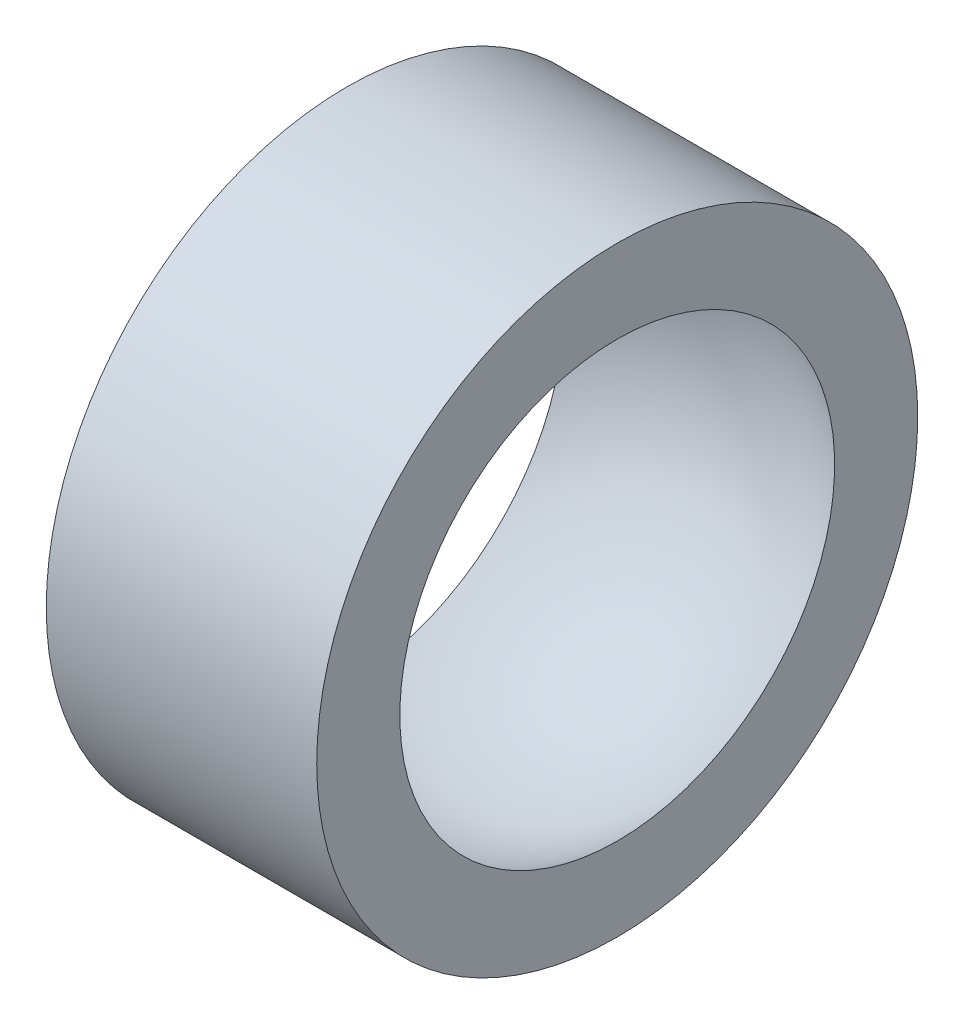
ISO-10303-21;
HEADER;
FILE_DESCRIPTION(('STEP AP214'),'2;1');
FILE_NAME('part.step','',(''),(''),'','','');
FILE_SCHEMA(('AUTOMOTIVE_DESIGN { 1 0 10303 214 1 1 1 1 }'));
ENDSEC;
DATA;
#1=APPLICATION_CONTEXT('core data for automotive mechanical design processes');
#2=APPLICATION_PROTOCOL_DEFINITION('international standard','automotive_design',2000,#1);
#3=PRODUCT_CONTEXT('',#1,'mechanical');
#4=PRODUCT('Part','Part','',(#3));
#5=PRODUCT_RELATED_PRODUCT_CATEGORY('part','',(#4));
#6=PRODUCT_DEFINITION_FORMATION('','',#4);
#7=PRODUCT_DEFINITION_CONTEXT('part definition',#1,'design');
#8=PRODUCT_DEFINITION('design','',#6,#7);
#9=PRODUCT_DEFINITION_SHAPE('','',#8);
#10=(LENGTH_UNIT() NAMED_UNIT(*) SI_UNIT(.MILLI.,.METRE.));
#11=(NAMED_UNIT(*) PLANE_ANGLE_UNIT() SI_UNIT($,.RADIAN.));
#12=(NAMED_UNIT(*) SI_UNIT($,.STERADIAN.) SOLID_ANGLE_UNIT());
#13=UNCERTAINTY_MEASURE_WITH_UNIT(LENGTH_MEASURE(1.E-05),#10,'distance_accuracy_value','');
#14=(GEOMETRIC_REPRESENTATION_CONTEXT(3) GLOBAL_UNCERTAINTY_ASSIGNED_CONTEXT((#13)) GLOBAL_UNIT_ASSIGNED_CONTEXT((#10,
#11,#12)) REPRESENTATION_CONTEXT('',''));
#15=CARTESIAN_POINT('',(0.,0.,0.));
#16=DIRECTION('',(0.,0.,1.));
#17=DIRECTION('',(1.,0.,0.));
#18=AXIS2_PLACEMENT_3D('',#15,#16,#17);
#19=CARTESIAN_POINT('',(0.,0.,0.));
#20=DIRECTION('',(-1.,0.,0.));
#21=DIRECTION('',(0.,1.,0.));
#22=AXIS2_PLACEMENT_3D('',#19,#20,#21);
#23=SPHERICAL_SURFACE('',#22,6.39);
#24=CARTESIAN_POINT('',(-3.375,0.,0.));
#25=DIRECTION('',(-1.,0.,0.));
#26=DIRECTION('',(0.,0.,1.));
#27=AXIS2_PLACEMENT_3D('',#24,#25,#26);
#28=CIRCLE('',#27,5.42599990785109);
#29=CARTESIAN_POINT('',(-3.375,5.42599990785109,0.));
#30=VERTEX_POINT('',#29);
#31=EDGE_CURVE('E49',#30,#30,#28,.T.);
#32=CARTESIAN_POINT('',(3.375,0.,0.));
#33=DIRECTION('',(-1.,0.,0.));
#34=DIRECTION('',(0.,0.,1.));
#35=AXIS2_PLACEMENT_3D('',#32,#33,#34);
#36=CIRCLE('',#35,5.42599990785109);
#37=CARTESIAN_POINT('',(3.375,5.42599990785109,0.));
#38=VERTEX_POINT('',#37);
#39=EDGE_CURVE('E10',#38,#38,#36,.T.);
#40=CARTESIAN_POINT('',(-3.375,5.42599990785109,0.));
#41=CARTESIAN_POINT('',(-3.31209905535115,5.46512527916241,0.));
#42=CARTESIAN_POINT('',(-3.2485172228918,5.50315592084235,0.));
#43=CARTESIAN_POINT('',(-3.12006990033702,5.5769838821495,0.));
#44=CARTESIAN_POINT('',(-3.05520441024159,5.6127812017767,0.));
#45=CARTESIAN_POINT('',(-2.92426789039952,5.68209865618841,0.));
#46=CARTESIAN_POINT('',(-2.85819686065288,5.71561879097291,0.));
#47=CARTESIAN_POINT('',(-2.72492925339779,5.78034149056102,0.));
#48=CARTESIAN_POINT('',(-2.65773267588934,5.81154405536463,0.));
#49=CARTESIAN_POINT('',(-2.52229521473992,5.87159383872458,0.));
#50=CARTESIAN_POINT('',(-2.45405433109895,5.90044105728093,0.));
#51=CARTESIAN_POINT('',(-2.31661079212609,5.95574527231276,0.));
#52=CARTESIAN_POINT('',(-2.2474081367942,5.98220226878824,0.));
#53=CARTESIAN_POINT('',(-2.10812474401169,6.03269404055289,0.));
#54=CARTESIAN_POINT('',(-2.03804400656107,6.05672881584205,0.));
#55=CARTESIAN_POINT('',(-1.89708920317923,6.10234707920849,0.));
#56=CARTESIAN_POINT('',(-1.82621513724801,6.12393056728576,0.));
#57=CARTESIAN_POINT('',(-1.68375938939219,6.16462015370397,0.));
#58=CARTESIAN_POINT('',(-1.61217770746758,6.1837262520449,0.));
#59=CARTESIAN_POINT('',(-1.4683932960321,6.21943795280207,0.));
#60=CARTESIAN_POINT('',(-1.39619056652121,6.23604355521831,0.));
#61=CARTESIAN_POINT('',(-1.25125137935221,6.26673418187797,0.));
#62=CARTESIAN_POINT('',(-1.17851492169408,6.2808192061214,0.));
#63=CARTESIAN_POINT('',(-1.03259624315274,6.3064516425054,0.));
#64=CARTESIAN_POINT('',(-0.95941402226954,6.31799905464596,0.));
#65=CARTESIAN_POINT('',(-0.812692321287672,6.33854230178805,0.));
#66=CARTESIAN_POINT('',(-0.739152841189008,6.34753813678958,0.));
#67=CARTESIAN_POINT('',(-0.591805557843388,6.36296735040665,0.));
#68=CARTESIAN_POINT('',(-0.517997754596433,6.36940072902221,0.));
#69=CARTESIAN_POINT('',(-0.37020308552179,6.37969724956489,0.));
#70=CARTESIAN_POINT('',(-0.296216219694102,6.38356039149202,0.));
#71=CARTESIAN_POINT('',(-0.148152902577609,6.38871176670958,0.));
#72=CARTESIAN_POINT('',(-0.0740764512888047,6.39000000000001,0.));
#73=CARTESIAN_POINT('',(0.0740764512888042,6.39000000000001,0.));
#74=CARTESIAN_POINT('',(0.148152902577609,6.38871176670958,0.));
#75=CARTESIAN_POINT('',(0.296216219694101,6.38356039149202,0.));
#76=CARTESIAN_POINT('',(0.37020308552179,6.37969724956489,0.));
#77=CARTESIAN_POINT('',(0.517997754596433,6.36940072902221,0.));
#78=CARTESIAN_POINT('',(0.591805557843388,6.36296735040665,0.));
#79=CARTESIAN_POINT('',(0.739152841189008,6.34753813678958,0.));
#80=CARTESIAN_POINT('',(0.812692321287672,6.33854230178805,0.));
#81=CARTESIAN_POINT('',(0.95941402226954,6.31799905464596,0.));
#82=CARTESIAN_POINT('',(1.03259624315274,6.3064516425054,0.));
#83=CARTESIAN_POINT('',(1.17851492169408,6.2808192061214,0.));
#84=CARTESIAN_POINT('',(1.25125137935221,6.26673418187797,0.));
#85=CARTESIAN_POINT('',(1.39619056652121,6.23604355521831,0.));
#86=CARTESIAN_POINT('',(1.46839329603209,6.21943795280207,0.));
#87=CARTESIAN_POINT('',(1.61217770746758,6.1837262520449,0.));
#88=CARTESIAN_POINT('',(1.68375938939219,6.16462015370397,0.));
#89=CARTESIAN_POINT('',(1.82621513724801,6.12393056728576,0.));
#90=CARTESIAN_POINT('',(1.89708920317923,6.10234707920849,0.));
#91=CARTESIAN_POINT('',(2.03804400656107,6.05672881584206,0.));
#92=CARTESIAN_POINT('',(2.10812474401169,6.03269404055289,0.));
#93=CARTESIAN_POINT('',(2.2474081367942,5.98220226878824,0.));
#94=CARTESIAN_POINT('',(2.31661079212609,5.95574527231276,0.));
#95=CARTESIAN_POINT('',(2.45405433109896,5.90044105728094,0.));
#96=CARTESIAN_POINT('',(2.52229521473992,5.87159383872458,0.));
#97=CARTESIAN_POINT('',(2.65773267588934,5.81154405536463,0.));
#98=CARTESIAN_POINT('',(2.72492925339779,5.78034149056102,0.));
#99=CARTESIAN_POINT('',(2.85819686065288,5.71561879097291,0.));
#100=CARTESIAN_POINT('',(2.92426789039952,5.68209865618841,0.));
#101=CARTESIAN_POINT('',(3.05520441024159,5.61278120177671,0.));
#102=CARTESIAN_POINT('',(3.12006990033702,5.5769838821495,0.));
#103=CARTESIAN_POINT('',(3.2485172228918,5.50315592084235,0.));
#104=CARTESIAN_POINT('',(3.31209905535115,5.46512527916241,0.));
#105=CARTESIAN_POINT('',(3.375,5.42599990785109,0.));
#106=B_SPLINE_CURVE_WITH_KNOTS('',3,(#40,#41,#42,#43,#44,#45,#46,#47,#48,#49,#50,#51,#52,#53,
#54,#55,#56,#57,#58,#59,#60,#61,#62,#63,#64,#65,#66,#67,#68,#69,#70,#71,#72,#73,#74,#75,#76,#77,
#78,#79,#80,#81,#82,#83,#84,#85,#86,#87,#88,#89,#90,#91,#92,#93,#94,#95,#96,#97,#98,#99,#100,
#101,#102,#103,#104,#105),.UNSPECIFIED.,.F.,.F.,(4,2,2,2,2,2,2,2,2,2,2,2,2,2,2,2,2,2,2,2,2,2,2,
2,2,2,2,2,2,2,2,2,4),(0.,0.222218156530577,0.444436313061153,0.66665446959173,0.888872626122306,
1.11109078265288,1.33330893918346,1.55552709571404,1.77774525224461,1.99996340877519,
2.22218156530577,2.44439972183634,2.66661787836692,2.8888360348975,3.11105419142807,
3.33327234795865,3.55549050448923,3.7777086610198,3.99992681755038,4.22214497408096,
4.44436313061153,4.66658128714211,4.88879944367269,5.11101760020326,5.33323575673384,
5.55545391326442,5.77767206979499,5.99989022632557,6.22210838285615,6.44432653938672,
6.6665446959173,6.88876285244788,7.11098100897845),.UNSPECIFIED.);
#107=EDGE_CURVE('BSEAM35',#30,#38,#106,.T.);
#108=ORIENTED_EDGE('',*,*,#31,.T.);
#109=ORIENTED_EDGE('',*,*,#39,.F.);
#110=ORIENTED_EDGE('',*,*,#107,.T.);
#111=ORIENTED_EDGE('',*,*,#107,.F.);
#112=EDGE_LOOP('',(#108,#110,#109,#111));
#113=FACE_BOUND('',#112,.T.);
#114=ADVANCED_FACE('F35',(#113),#23,.F.);
#115=CARTESIAN_POINT('',(3.375,0.,0.));
#116=DIRECTION('',(-1.,0.,0.));
#117=DIRECTION('',(0.,0.,1.));
#118=AXIS2_PLACEMENT_3D('',#115,#116,#117);
#119=PLANE('',#118);
#120=CARTESIAN_POINT('',(3.375,0.,0.));
#121=DIRECTION('',(-1.,0.,0.));
#122=DIRECTION('',(0.,0.,1.));
#123=AXIS2_PLACEMENT_3D('',#120,#121,#122);
#124=CIRCLE('',#123,7.5);
#125=CARTESIAN_POINT('',(3.375,0.,7.5));
#126=VERTEX_POINT('',#125);
#127=EDGE_CURVE('E41',#126,#126,#124,.T.);
#128=ORIENTED_EDGE('',*,*,#127,.F.);
#129=EDGE_LOOP('',(#128));
#130=FACE_BOUND('',#129,.T.);
#131=ORIENTED_EDGE('',*,*,#39,.T.);
#132=EDGE_LOOP('',(#131));
#133=FACE_BOUND('',#132,.T.);
#134=ADVANCED_FACE('F65',(#130,#133),#119,.F.);
#135=CARTESIAN_POINT('',(0.,0.,0.));
#136=DIRECTION('',(-1.,0.,0.));
#137=DIRECTION('',(0.,0.,1.));
#138=AXIS2_PLACEMENT_3D('',#135,#136,#137);
#139=CYLINDRICAL_SURFACE('',#138,7.5);
#140=ORIENTED_EDGE('',*,*,#127,.T.);
#141=EDGE_LOOP('',(#140));
#142=FACE_BOUND('',#141,.T.);
#143=CARTESIAN_POINT('',(-3.375,0.,0.));
#144=DIRECTION('',(-1.,0.,0.));
#145=DIRECTION('',(0.,0.,1.));
#146=AXIS2_PLACEMENT_3D('',#143,#144,#145);
#147=CIRCLE('',#146,7.5);
#148=CARTESIAN_POINT('',(-3.375,0.,7.5));
#149=VERTEX_POINT('',#148);
#150=EDGE_CURVE('E45',#149,#149,#147,.T.);
#151=ORIENTED_EDGE('',*,*,#150,.F.);
#152=EDGE_LOOP('',(#151));
#153=FACE_BOUND('',#152,.T.);
#154=ADVANCED_FACE('F59',(#142,#153),#139,.T.);
#155=CARTESIAN_POINT('',(-3.375,0.,0.));
#156=DIRECTION('',(-1.,0.,0.));
#157=DIRECTION('',(0.,0.,1.));
#158=AXIS2_PLACEMENT_3D('',#155,#156,#157);
#159=PLANE('',#158);
#160=ORIENTED_EDGE('',*,*,#150,.T.);
#161=EDGE_LOOP('',(#160));
#162=FACE_BOUND('',#161,.T.);
#163=ORIENTED_EDGE('',*,*,#31,.F.);
#164=EDGE_LOOP('',(#163));
#165=FACE_BOUND('',#164,.T.);
#166=ADVANCED_FACE('F57',(#162,#165),#159,.T.);
#167=CLOSED_SHELL('',(#114,#134,#154,#166));
#168=MANIFOLD_SOLID_BREP('B2',#167);
#169=ADVANCED_BREP_SHAPE_REPRESENTATION('',(#18,#168),#14);
#170=SHAPE_DEFINITION_REPRESENTATION(#9,#169);
ENDSEC;
END-ISO-10303-21;
